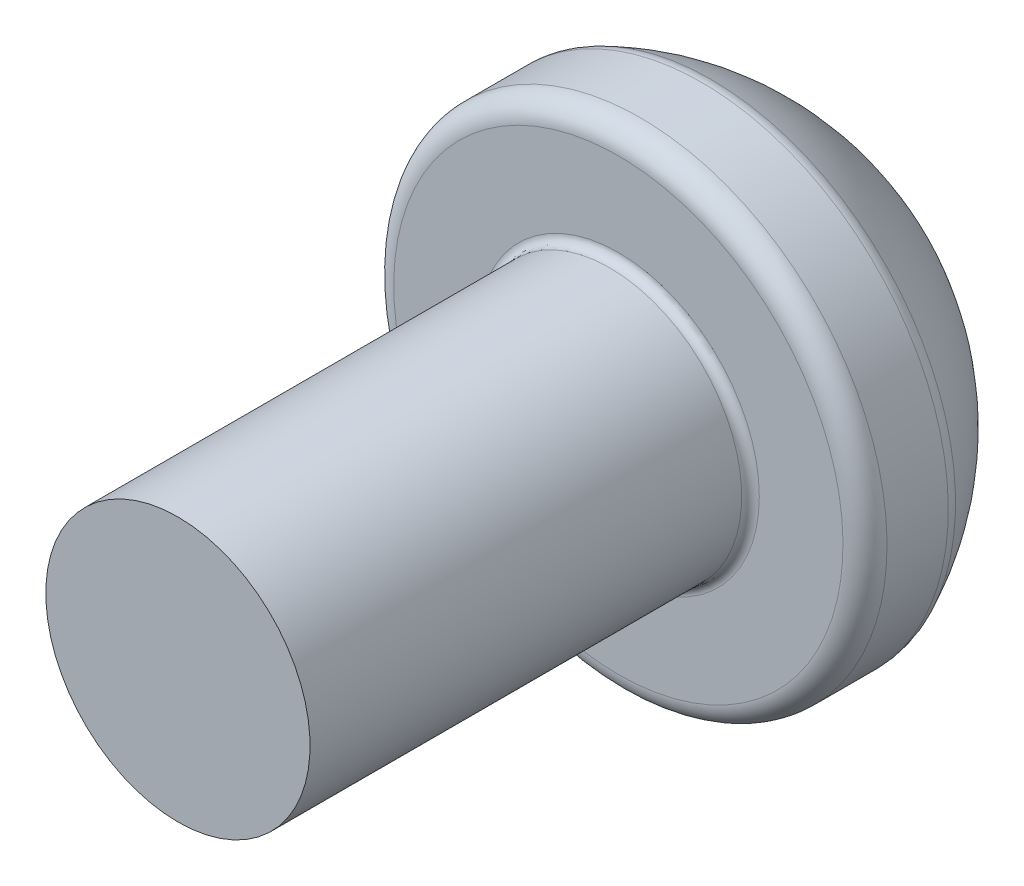
ISO-10303-21;
HEADER;
FILE_DESCRIPTION(('STEP AP214'),'2;1');
FILE_NAME('part.step','',(''),(''),'','','');
FILE_SCHEMA(('AUTOMOTIVE_DESIGN { 1 0 10303 214 1 1 1 1 }'));
ENDSEC;
DATA;
#1=APPLICATION_CONTEXT('core data for automotive mechanical design processes');
#2=APPLICATION_PROTOCOL_DEFINITION('international standard','automotive_design',2000,#1);
#3=PRODUCT_CONTEXT('',#1,'mechanical');
#4=PRODUCT('Part','Part','',(#3));
#5=PRODUCT_RELATED_PRODUCT_CATEGORY('part','',(#4));
#6=PRODUCT_DEFINITION_FORMATION('','',#4);
#7=PRODUCT_DEFINITION_CONTEXT('part definition',#1,'design');
#8=PRODUCT_DEFINITION('design','',#6,#7);
#9=PRODUCT_DEFINITION_SHAPE('','',#8);
#10=(LENGTH_UNIT() NAMED_UNIT(*) SI_UNIT(.MILLI.,.METRE.));
#11=(NAMED_UNIT(*) PLANE_ANGLE_UNIT() SI_UNIT($,.RADIAN.));
#12=(NAMED_UNIT(*) SI_UNIT($,.STERADIAN.) SOLID_ANGLE_UNIT());
#13=UNCERTAINTY_MEASURE_WITH_UNIT(LENGTH_MEASURE(1.E-05),#10,'distance_accuracy_value','');
#14=(GEOMETRIC_REPRESENTATION_CONTEXT(3) GLOBAL_UNCERTAINTY_ASSIGNED_CONTEXT((#13)) GLOBAL_UNIT_ASSIGNED_CONTEXT((#10,
#11,#12)) REPRESENTATION_CONTEXT('',''));
#15=CARTESIAN_POINT('',(0.,0.,0.));
#16=DIRECTION('',(0.,0.,1.));
#17=DIRECTION('',(1.,0.,0.));
#18=AXIS2_PLACEMENT_3D('',#15,#16,#17);
#19=CARTESIAN_POINT('',(0.,0.,5.00000000000001));
#20=DIRECTION('',(0.,0.,1.));
#21=DIRECTION('',(0.,-0.999999999999998,0.));
#22=AXIS2_PLACEMENT_3D('',#19,#20,#21);
#23=PLANE('',#22);
#24=CARTESIAN_POINT('',(0.,0.,5.00000000000001));
#25=DIRECTION('',(0.,0.,-1.));
#26=DIRECTION('',(0.,0.999999999999998,0.));
#27=AXIS2_PLACEMENT_3D('',#24,#25,#26);
#28=CIRCLE('',#27,1.5);
#29=CARTESIAN_POINT('',(0.,1.5,5.00000000000001));
#30=VERTEX_POINT('',#29);
#31=EDGE_CURVE('E266',#30,#30,#28,.T.);
#32=ORIENTED_EDGE('',*,*,#31,.F.);
#33=EDGE_LOOP('',(#32));
#34=FACE_BOUND('',#33,.T.);
#35=ADVANCED_FACE('F34',(#34),#23,.T.);
#36=CARTESIAN_POINT('',(0.,0.,-2.4));
#37=DIRECTION('',(0.,0.,-1.));
#38=DIRECTION('',(0.,0.999999999999998,0.));
#39=AXIS2_PLACEMENT_3D('',#36,#37,#38);
#40=CYLINDRICAL_SURFACE('',#39,1.5);
#41=CARTESIAN_POINT('',(0.,0.,0.100000000000003));
#42=DIRECTION('',(0.,0.,1.));
#43=DIRECTION('',(0.,-0.999999999999998,0.));
#44=AXIS2_PLACEMENT_3D('',#41,#42,#43);
#45=CIRCLE('',#44,1.5);
#46=CARTESIAN_POINT('',(0.,-1.5,0.100000000000003));
#47=VERTEX_POINT('',#46);
#48=EDGE_CURVE('E272',#47,#47,#45,.T.);
#49=ORIENTED_EDGE('',*,*,#48,.T.);
#50=EDGE_LOOP('',(#49));
#51=FACE_BOUND('',#50,.T.);
#52=ORIENTED_EDGE('',*,*,#31,.T.);
#53=EDGE_LOOP('',(#52));
#54=FACE_BOUND('',#53,.T.);
#55=ADVANCED_FACE('F307',(#51,#54),#40,.T.);
#56=CARTESIAN_POINT('',(0.,1.49999999999997,0.));
#57=DIRECTION('',(0.,0.,1.));
#58=DIRECTION('',(0.,-0.999999999999998,0.));
#59=AXIS2_PLACEMENT_3D('',#56,#57,#58);
#60=PLANE('',#59);
#61=CARTESIAN_POINT('',(0.,0.,0.));
#62=DIRECTION('',(0.,0.,1.));
#63=DIRECTION('',(0.,-0.999999999999998,0.));
#64=AXIS2_PLACEMENT_3D('',#61,#62,#63);
#65=CIRCLE('',#64,2.55);
#66=CARTESIAN_POINT('',(0.,-2.54999999999999,0.));
#67=VERTEX_POINT('',#66);
#68=EDGE_CURVE('E11',#67,#67,#65,.T.);
#69=ORIENTED_EDGE('',*,*,#68,.T.);
#70=EDGE_LOOP('',(#69));
#71=FACE_BOUND('',#70,.T.);
#72=CARTESIAN_POINT('',(0.,0.,0.));
#73=DIRECTION('',(0.,0.,1.));
#74=DIRECTION('',(0.,-0.999999999999998,0.));
#75=AXIS2_PLACEMENT_3D('',#72,#73,#74);
#76=CIRCLE('',#75,1.6);
#77=CARTESIAN_POINT('',(0.,-1.6,0.));
#78=VERTEX_POINT('',#77);
#79=EDGE_CURVE('E269',#78,#78,#76,.F.);
#80=ORIENTED_EDGE('',*,*,#79,.T.);
#81=EDGE_LOOP('',(#80));
#82=FACE_BOUND('',#81,.T.);
#83=ADVANCED_FACE('F312',(#71,#82),#60,.T.);
#84=CARTESIAN_POINT('',(0.,0.,-2.4));
#85=DIRECTION('',(0.,0.,-1.));
#86=DIRECTION('',(0.,0.999999999999998,0.));
#87=AXIS2_PLACEMENT_3D('',#84,#85,#86);
#88=CYLINDRICAL_SURFACE('',#87,2.8);
#89=CARTESIAN_POINT('',(0.,0.,-0.945424841825027));
#90=DIRECTION('',(0.,0.,1.));
#91=DIRECTION('',(0.,-0.999999999999998,0.));
#92=AXIS2_PLACEMENT_3D('',#89,#90,#91);
#93=CIRCLE('',#92,2.8);
#94=CARTESIAN_POINT('',(0.,-2.80000000000008,-0.945424841825026));
#95=VERTEX_POINT('',#94);
#96=EDGE_CURVE('E41',#95,#95,#93,.T.);
#97=ORIENTED_EDGE('',*,*,#96,.T.);
#98=EDGE_LOOP('',(#97));
#99=FACE_BOUND('',#98,.T.);
#100=CARTESIAN_POINT('',(0.,-1.66533453693773E-13,-0.249999999999986));
#101=DIRECTION('',(0.,0.,1.));
#102=DIRECTION('',(0.,-0.999999999999998,0.));
#103=AXIS2_PLACEMENT_3D('',#100,#101,#102);
#104=CIRCLE('',#103,2.8);
#105=CARTESIAN_POINT('',(0.,-2.80000000000016,-0.249999999999986));
#106=VERTEX_POINT('',#105);
#107=EDGE_CURVE('E278',#106,#106,#104,.F.);
#108=ORIENTED_EDGE('',*,*,#107,.T.);
#109=EDGE_LOOP('',(#108));
#110=FACE_BOUND('',#109,.T.);
#111=ADVANCED_FACE('F283',(#99,#110),#88,.T.);
#112=CARTESIAN_POINT('',(0.,0.,0.253000000000017));
#113=DIRECTION('',(0.,0.,-1.));
#114=DIRECTION('',(0.,0.999999999999998,0.));
#115=AXIS2_PLACEMENT_3D('',#112,#113,#114);
#116=SPHERICAL_SURFACE('',#115,3.06757379699332);
#117=CARTESIAN_POINT('',(0.,0.,-1.05175966463462));
#118=DIRECTION('',(0.,0.,1.));
#119=DIRECTION('',(0.,-0.999999999999998,0.));
#120=AXIS2_PLACEMENT_3D('',#117,#118,#119);
#121=CIRCLE('',#120,2.77625849256559);
#122=CARTESIAN_POINT('',(0.,2.77625849256557,-1.05175966463462));
#123=VERTEX_POINT('',#122);
#124=EDGE_CURVE('E275',#123,#123,#121,.F.);
#125=CARTESIAN_POINT('',(0.,0.,-2.4));
#126=DIRECTION('',(0.,0.,-1.));
#127=DIRECTION('',(0.,0.999999999999998,0.));
#128=AXIS2_PLACEMENT_3D('',#125,#126,#127);
#129=CIRCLE('',#128,1.54);
#130=CARTESIAN_POINT('',(0.,1.53999999999997,-2.4));
#131=VERTEX_POINT('',#130);
#132=EDGE_CURVE('E262',#131,#131,#129,.T.);
#133=CARTESIAN_POINT('',(0.,2.77625849256557,-1.05175966463462));
#134=CARTESIAN_POINT('',(0.,2.76802873560927,-1.06927093928297));
#135=CARTESIAN_POINT('',(0.,2.75963325856509,-1.08670432952201));
#136=CARTESIAN_POINT('',(0.,2.74251396302792,-1.1214091448773));
#137=CARTESIAN_POINT('',(0.,2.73379014453494,-1.13868056999355));
#138=CARTESIAN_POINT('',(0.,2.71601726482716,-1.17305525879907));
#139=CARTESIAN_POINT('',(0.,2.70696820361235,-1.19015852248834));
#140=CARTESIAN_POINT('',(0.,2.68854808514224,-1.22419076788491));
#141=CARTESIAN_POINT('',(0.,2.67917702788693,-1.24111974959221));
#142=CARTESIAN_POINT('',(0.,2.66011627086745,-1.27479736870806));
#143=CARTESIAN_POINT('',(0.,2.65042657110328,-1.2915460061166));
#144=CARTESIAN_POINT('',(0.,2.63073199894962,-1.32485694000621));
#145=CARTESIAN_POINT('',(0.,2.62072712656013,-1.34141923648728));
#146=CARTESIAN_POINT('',(0.,2.6004057912812,-1.37435155831383));
#147=CARTESIAN_POINT('',(0.,2.59008932839175,-1.3907215836593));
#148=CARTESIAN_POINT('',(0.,2.56914850596592,-1.42326350192949));
#149=CARTESIAN_POINT('',(0.,2.55852414642952,-1.43943539485421));
#150=CARTESIAN_POINT('',(0.,2.53697133476195,-1.47157525791774));
#151=CARTESIAN_POINT('',(0.,2.52604288263076,-1.48754322805655));
#152=CARTESIAN_POINT('',(0.,2.50388579871805,-1.51926952820363));
#153=CARTESIAN_POINT('',(0.,2.49265716693652,-1.53502785821189));
#154=CARTESIAN_POINT('',(0.,2.46990374414402,-1.56632923581349));
#155=CARTESIAN_POINT('',(0.,2.45837895313305,-1.58187228340683));
#156=CARTESIAN_POINT('',(0.,2.43503733834349,-1.6127375309767));
#157=CARTESIAN_POINT('',(0.,2.4232205145649,-1.62805973095323));
#158=CARTESIAN_POINT('',(0.,2.39929906526429,-1.65847779716217));
#159=CARTESIAN_POINT('',(0.,2.38719443974227,-1.67357366339458));
#160=CARTESIAN_POINT('',(0.,2.36270172102672,-1.70353365702699));
#161=CARTESIAN_POINT('',(0.,2.35031362783318,-1.718397784427));
#162=CARTESIAN_POINT('',(0.,2.32525840934235,-1.74788897828058));
#163=CARTESIAN_POINT('',(0.,2.31259128404505,-1.76251604473417));
#164=CARTESIAN_POINT('',(0.,2.28698253682215,-1.79152787946083));
#165=CARTESIAN_POINT('',(0.,2.27404091489653,-1.80591264773389));
#166=CARTESIAN_POINT('',(0.,2.24788780817621,-1.83443473562045));
#167=CARTESIAN_POINT('',(0.,2.23467632338149,-1.84857205523394));
#168=CARTESIAN_POINT('',(0.,2.2079882213068,-1.87659418392154));
#169=CARTESIAN_POINT('',(0.,2.19451160402683,-1.89047899299564));
#170=CARTESIAN_POINT('',(0.,2.1672980622964,-1.91799112913625));
#171=CARTESIAN_POINT('',(0.,2.15356113784594,-1.93161845620276));
#172=CARTESIAN_POINT('',(0.,2.12583190029252,-1.95861074905163));
#173=CARTESIAN_POINT('',(0.,2.11183958718956,-1.971975714834));
#174=CARTESIAN_POINT('',(0.,2.08360458229125,-1.99843849977674));
#175=CARTESIAN_POINT('',(0.,2.0693618904959,-2.0115363189371));
#176=CARTESIAN_POINT('',(0.,2.04063122782126,-2.03746012095012));
#177=CARTESIAN_POINT('',(0.,2.02614325694197,-2.05028610380276));
#178=CARTESIAN_POINT('',(0.,1.99692722353018,-2.07566164084562));
#179=CARTESIAN_POINT('',(0.,1.98219916099768,-2.08821119503583));
#180=CARTESIAN_POINT('',(0.,1.9525082176757,-2.11302938137545));
#181=CARTESIAN_POINT('',(0.,1.93754533688622,-2.12529801352486));
#182=CARTESIAN_POINT('',(0.,1.9073901145216,-2.14954996298589));
#183=CARTESIAN_POINT('',(0.,1.89219777294645,-2.16153328029752));
#184=CARTESIAN_POINT('',(0.,1.86158906864719,-2.18521030945437));
#185=CARTESIAN_POINT('',(0.,1.84617270592306,-2.19690402129959));
#186=CARTESIAN_POINT('',(0.,1.81512147914836,-2.21999765254702));
#187=CARTESIAN_POINT('',(0.,1.79948661509778,-2.23139757194922));
#188=CARTESIAN_POINT('',(0.,1.76800398382111,-2.25389953668146));
#189=CARTESIAN_POINT('',(0.,1.75215621659502,-2.2650015820115));
#190=CARTESIAN_POINT('',(0.,1.72025345299823,-2.28690382304649));
#191=CARTESIAN_POINT('',(0.,1.70419845662753,-2.29770401875144));
#192=CARTESIAN_POINT('',(0.,1.67188698427806,-2.31899869521752));
#193=CARTESIAN_POINT('',(0.,1.65563050829929,-2.32949317597865));
#194=CARTESIAN_POINT('',(0.,1.62292189353211,-2.35017265865099));
#195=CARTESIAN_POINT('',(0.,1.6064697547437,-2.36035766056221));
#196=CARTESIAN_POINT('',(0.,1.57337571941815,-2.38041456247663));
#197=CARTESIAN_POINT('',(0.,1.55673382288101,-2.39028646247984));
#198=CARTESIAN_POINT('',(0.,1.53999999999997,-2.4));
#199=B_SPLINE_CURVE_WITH_KNOTS('',3,(#133,#134,#135,#136,#137,#138,#139,#140,#141,#142,#143,
#144,#145,#146,#147,#148,#149,#150,#151,#152,#153,#154,#155,#156,#157,#158,#159,#160,#161,#162,
#163,#164,#165,#166,#167,#168,#169,#170,#171,#172,#173,#174,#175,#176,#177,#178,#179,#180,#181,
#182,#183,#184,#185,#186,#187,#188,#189,#190,#191,#192,#193,#194,#195,#196,#197,#198),
.UNSPECIFIED.,.F.,.F.,(4,2,2,2,2,2,2,2,2,2,2,2,2,2,2,2,2,2,2,2,2,2,2,2,2,2,2,2,2,2,2,2,4),(0.,
0.0580453449347523,0.116090689869505,0.174136034804257,0.232181379739009,0.290226724673761,
0.348272069608513,0.406317414543265,0.464362759478017,0.52240810441277,0.580453449347522,
0.638498794282274,0.696544139217026,0.754589484151778,0.81263482908653,0.870680174021282,
0.928725518956034,0.986770863890786,1.04481620882554,1.10286155376029,1.16090689869504,
1.2189522436298,1.27699758856455,1.3350429334993,1.39308827843405,1.4511336233688,
1.50917896830355,1.56722431323831,1.62526965817306,1.68331500310781,1.74136034804256,
1.79940569297732,1.85745103791207),.UNSPECIFIED.);
#200=EDGE_CURVE('BSEAM294',#123,#131,#199,.T.);
#201=ORIENTED_EDGE('',*,*,#124,.T.);
#202=ORIENTED_EDGE('',*,*,#132,.F.);
#203=ORIENTED_EDGE('',*,*,#200,.T.);
#204=ORIENTED_EDGE('',*,*,#200,.F.);
#205=EDGE_LOOP('',(#201,#203,#202,#204));
#206=FACE_BOUND('',#205,.T.);
#207=ADVANCED_FACE('F294',(#206),#116,.T.);
#208=CARTESIAN_POINT('',(0.,0.,-2.4));
#209=DIRECTION('',(0.,0.,-1.));
#210=DIRECTION('',(0.,0.999999999999998,0.));
#211=AXIS2_PLACEMENT_3D('',#208,#209,#210);
#212=PLANE('',#211);
#213=CARTESIAN_POINT('',(0.,0.,-2.4));
#214=DIRECTION('',(0.,0.,-1.));
#215=DIRECTION('',(0.,0.999999999999998,0.));
#216=AXIS2_PLACEMENT_3D('',#213,#214,#215);
#217=CIRCLE('',#216,1.4);
#218=CARTESIAN_POINT('',(0.217707917147349,-1.38296900283832,-2.39999999999999));
#219=VERTEX_POINT('',#218);
#220=CARTESIAN_POINT('',(-0.217707917147342,-1.38296900283835,-2.39999999999998));
#221=VERTEX_POINT('',#220);
#222=EDGE_CURVE('E185',#219,#221,#217,.T.);
#223=ORIENTED_EDGE('',*,*,#222,.F.);
#224=CARTESIAN_POINT('',(0.80750000000001,-1.39863102711205,-2.39999999999999));
#225=DIRECTION('',(0.,0.,1.));
#226=DIRECTION('',(0.,0.999999999999998,0.));
#227=AXIS2_PLACEMENT_3D('',#224,#225,#226);
#228=CIRCLE('',#227,0.59);
#229=CARTESIAN_POINT('',(1.08883233053061,-0.880025088273867,-2.39999999999998));
#230=VERTEX_POINT('',#229);
#231=EDGE_CURVE('E183',#230,#219,#228,.T.);
#232=ORIENTED_EDGE('',*,*,#231,.F.);
#233=CARTESIAN_POINT('',(0.,0.,-2.4));
#234=DIRECTION('',(0.,0.,-1.));
#235=DIRECTION('',(0.,0.999999999999998,0.));
#236=AXIS2_PLACEMENT_3D('',#233,#234,#235);
#237=CIRCLE('',#236,1.4);
#238=CARTESIAN_POINT('',(1.30654024767798,-0.502943914564638,-2.4));
#239=VERTEX_POINT('',#238);
#240=EDGE_CURVE('E180',#239,#230,#237,.T.);
#241=ORIENTED_EDGE('',*,*,#240,.F.);
#242=CARTESIAN_POINT('',(1.61499999999998,-1.2490009027033E-13,-2.39999999999999));
#243=DIRECTION('',(0.,0.,1.));
#244=DIRECTION('',(0.,0.999999999999998,0.));
#245=AXIS2_PLACEMENT_3D('',#242,#243,#244);
#246=CIRCLE('',#245,0.59);
#247=CARTESIAN_POINT('',(1.30654024767801,0.502943914564374,-2.40000000000002));
#248=VERTEX_POINT('',#247);
#249=EDGE_CURVE('E178',#248,#239,#246,.T.);
#250=ORIENTED_EDGE('',*,*,#249,.F.);
#251=CARTESIAN_POINT('',(0.,0.,-2.4));
#252=DIRECTION('',(0.,0.,-1.));
#253=DIRECTION('',(0.,0.999999999999998,0.));
#254=AXIS2_PLACEMENT_3D('',#251,#252,#253);
#255=CIRCLE('',#254,1.4);
#256=CARTESIAN_POINT('',(1.08883233053061,0.880025088273562,-2.40000000000001));
#257=VERTEX_POINT('',#256);
#258=EDGE_CURVE('E175',#257,#248,#255,.T.);
#259=ORIENTED_EDGE('',*,*,#258,.F.);
#260=CARTESIAN_POINT('',(0.807499999999899,1.3986310271118,-2.39999999999996));
#261=DIRECTION('',(0.,0.,1.));
#262=DIRECTION('',(0.,0.999999999999998,0.));
#263=AXIS2_PLACEMENT_3D('',#260,#261,#262);
#264=CIRCLE('',#263,0.59);
#265=CARTESIAN_POINT('',(0.2177079171473,1.38296900283813,-2.4));
#266=VERTEX_POINT('',#265);
#267=EDGE_CURVE('E170',#266,#257,#264,.T.);
#268=ORIENTED_EDGE('',*,*,#267,.F.);
#269=CARTESIAN_POINT('',(0.,0.,-2.4));
#270=DIRECTION('',(0.,0.,-1.));
#271=DIRECTION('',(0.,0.999999999999998,0.));
#272=AXIS2_PLACEMENT_3D('',#269,#270,#271);
#273=CIRCLE('',#272,1.4);
#274=CARTESIAN_POINT('',(-0.217707917147376,1.38296900283813,-2.39999999999999));
#275=VERTEX_POINT('',#274);
#276=EDGE_CURVE('E168',#275,#266,#273,.T.);
#277=ORIENTED_EDGE('',*,*,#276,.F.);
#278=CARTESIAN_POINT('',(-0.807499999999961,1.39863102711166,-2.39999999999998));
#279=DIRECTION('',(0.,0.,1.));
#280=DIRECTION('',(0.,0.999999999999998,0.));
#281=AXIS2_PLACEMENT_3D('',#278,#279,#280);
#282=CIRCLE('',#281,0.59);
#283=CARTESIAN_POINT('',(-1.08883233053072,0.88002508827352,-2.39999999999998));
#284=VERTEX_POINT('',#283);
#285=EDGE_CURVE('E149',#284,#275,#282,.T.);
#286=ORIENTED_EDGE('',*,*,#285,.F.);
#287=CARTESIAN_POINT('',(0.,0.,-2.4));
#288=DIRECTION('',(0.,0.,-1.));
#289=DIRECTION('',(0.,0.999999999999998,0.));
#290=AXIS2_PLACEMENT_3D('',#287,#288,#289);
#291=CIRCLE('',#290,1.4);
#292=CARTESIAN_POINT('',(-1.30654024767813,0.502943914564319,-2.39999999999998));
#293=VERTEX_POINT('',#292);
#294=EDGE_CURVE('E158',#293,#284,#291,.T.);
#295=ORIENTED_EDGE('',*,*,#294,.F.);
#296=CARTESIAN_POINT('',(-1.61500000000007,-1.94289029309402E-13,-2.39999999999999));
#297=DIRECTION('',(0.,0.,1.));
#298=DIRECTION('',(0.,0.999999999999998,0.));
#299=AXIS2_PLACEMENT_3D('',#296,#297,#298);
#300=CIRCLE('',#299,0.59);
#301=CARTESIAN_POINT('',(-1.30654024767802,-0.502943914564555,-2.39999999999996));
#302=VERTEX_POINT('',#301);
#303=EDGE_CURVE('E161',#302,#293,#300,.T.);
#304=ORIENTED_EDGE('',*,*,#303,.F.);
#305=CARTESIAN_POINT('',(0.,0.,-2.4));
#306=DIRECTION('',(0.,0.,-1.));
#307=DIRECTION('',(0.,0.999999999999998,0.));
#308=AXIS2_PLACEMENT_3D('',#305,#306,#307);
#309=CIRCLE('',#308,1.4);
#310=CARTESIAN_POINT('',(-1.0888323305307,-0.880025088273881,-2.39999999999996));
#311=VERTEX_POINT('',#310);
#312=EDGE_CURVE('E190',#311,#302,#309,.T.);
#313=ORIENTED_EDGE('',*,*,#312,.F.);
#314=CARTESIAN_POINT('',(-0.807500000000017,-1.39863102711194,-2.4));
#315=DIRECTION('',(0.,0.,1.));
#316=DIRECTION('',(0.,0.999999999999998,0.));
#317=AXIS2_PLACEMENT_3D('',#314,#315,#316);
#318=CIRCLE('',#317,0.59);
#319=EDGE_CURVE('E188',#221,#311,#318,.T.);
#320=ORIENTED_EDGE('',*,*,#319,.F.);
#321=EDGE_LOOP('',(#223,#232,#241,#250,#259,#268,#277,#286,#295,#304,#313,#320));
#322=FACE_BOUND('',#321,.T.);
#323=ORIENTED_EDGE('',*,*,#132,.T.);
#324=EDGE_LOOP('',(#323));
#325=FACE_BOUND('',#324,.T.);
#326=ADVANCED_FACE('F165',(#322,#325),#212,.T.);
#327=CARTESIAN_POINT('',(0.,0.,0.100000000000003));
#328=DIRECTION('',(0.,0.,1.));
#329=DIRECTION('',(0.,-0.999999999999998,0.));
#330=AXIS2_PLACEMENT_3D('',#327,#328,#329);
#331=TOROIDAL_SURFACE('',#330,1.6,0.1);
#332=ORIENTED_EDGE('',*,*,#48,.F.);
#333=EDGE_LOOP('',(#332));
#334=FACE_BOUND('',#333,.T.);
#335=ORIENTED_EDGE('',*,*,#79,.F.);
#336=EDGE_LOOP('',(#335));
#337=FACE_BOUND('',#336,.T.);
#338=ADVANCED_FACE('F290',(#334,#337),#331,.F.);
#339=CARTESIAN_POINT('',(0.,0.,-0.945424841825027));
#340=DIRECTION('',(0.,0.,1.));
#341=DIRECTION('',(0.,-0.999999999999998,0.));
#342=AXIS2_PLACEMENT_3D('',#339,#340,#341);
#343=TOROIDAL_SURFACE('',#342,2.55,0.25);
#344=ORIENTED_EDGE('',*,*,#96,.F.);
#345=EDGE_LOOP('',(#344));
#346=FACE_BOUND('',#345,.T.);
#347=ORIENTED_EDGE('',*,*,#124,.F.);
#348=EDGE_LOOP('',(#347));
#349=FACE_BOUND('',#348,.T.);
#350=ADVANCED_FACE('F286',(#346,#349),#343,.T.);
#351=CARTESIAN_POINT('',(0.,-1.66533453693773E-13,-0.249999999999986));
#352=DIRECTION('',(0.,0.,1.));
#353=DIRECTION('',(0.,-0.999999999999998,0.));
#354=AXIS2_PLACEMENT_3D('',#351,#352,#353);
#355=TOROIDAL_SURFACE('',#354,2.55,0.25);
#356=ORIENTED_EDGE('',*,*,#68,.F.);
#357=EDGE_LOOP('',(#356));
#358=FACE_BOUND('',#357,.T.);
#359=ORIENTED_EDGE('',*,*,#107,.F.);
#360=EDGE_LOOP('',(#359));
#361=FACE_BOUND('',#360,.T.);
#362=ADVANCED_FACE('F289',(#358,#361),#355,.T.);
#363=CARTESIAN_POINT('',(-1.615,-1.52655665885959E-13,-1.40000000000001));
#364=DIRECTION('',(0.,0.,-1.));
#365=DIRECTION('',(0.,0.999999999999998,0.));
#366=AXIS2_PLACEMENT_3D('',#363,#364,#365);
#367=CYLINDRICAL_SURFACE('',#366,0.59);
#368=CARTESIAN_POINT('',(-1.615,-1.52655665885959E-13,-1.40000000000001));
#369=DIRECTION('',(0.,0.,1.));
#370=DIRECTION('',(0.,0.999999999999998,0.));
#371=AXIS2_PLACEMENT_3D('',#368,#369,#370);
#372=CIRCLE('',#371,0.59);
#373=CARTESIAN_POINT('',(-1.30654024767805,-0.502943914564569,-1.39999999999998));
#374=VERTEX_POINT('',#373);
#375=CARTESIAN_POINT('',(-1.02499999999993,-1.11022302462516E-13,-1.39999999999999));
#376=VERTEX_POINT('',#375);
#377=EDGE_CURVE('E194',#374,#376,#372,.T.);
#378=ORIENTED_EDGE('',*,*,#377,.F.);
#379=DIRECTION('',(0.,0.,-1.));
#380=VECTOR('',#379,1.);
#381=CARTESIAN_POINT('',(-1.30654024767805,-0.502943914564569,-1.39999999999998));
#382=LINE('',#381,#380);
#383=EDGE_CURVE('E229',#374,#302,#382,.T.);
#384=ORIENTED_EDGE('',*,*,#383,.T.);
#385=ORIENTED_EDGE('',*,*,#303,.T.);
#386=DIRECTION('',(0.,0.,-1.));
#387=VECTOR('',#386,1.);
#388=CARTESIAN_POINT('',(-1.30654024767802,0.502943914564263,-1.39999999999998));
#389=LINE('',#388,#387);
#390=CARTESIAN_POINT('',(-1.30654024767802,0.502943914564263,-1.39999999999998));
#391=VERTEX_POINT('',#390);
#392=EDGE_CURVE('E48',#391,#293,#389,.T.);
#393=ORIENTED_EDGE('',*,*,#392,.F.);
#394=EDGE_CURVE('E193',#376,#391,#372,.T.);
#395=ORIENTED_EDGE('',*,*,#394,.F.);
#396=EDGE_LOOP('',(#378,#384,#385,#393,#395));
#397=FACE_BOUND('',#396,.T.);
#398=ADVANCED_FACE('F348',(#397),#367,.T.);
#399=CARTESIAN_POINT('',(-0.80749999999994,-1.39863102711192,-1.40000000000001));
#400=DIRECTION('',(0.,0.,-1.));
#401=DIRECTION('',(0.,0.999999999999998,0.));
#402=AXIS2_PLACEMENT_3D('',#399,#400,#401);
#403=CYLINDRICAL_SURFACE('',#402,0.59);
#404=CARTESIAN_POINT('',(-0.80749999999994,-1.39863102711192,-1.40000000000001));
#405=DIRECTION('',(0.,0.,1.));
#406=DIRECTION('',(0.,0.999999999999998,0.));
#407=AXIS2_PLACEMENT_3D('',#404,#405,#406);
#408=CIRCLE('',#407,0.59);
#409=CARTESIAN_POINT('',(-0.217707917147272,-1.38296900283838,-1.39999999999998));
#410=VERTEX_POINT('',#409);
#411=CARTESIAN_POINT('',(-0.512499999999853,-0.887676038879168,-1.39999999999998));
#412=VERTEX_POINT('',#411);
#413=EDGE_CURVE('E223',#410,#412,#408,.T.);
#414=ORIENTED_EDGE('',*,*,#413,.F.);
#415=DIRECTION('',(0.,0.,-1.));
#416=VECTOR('',#415,1.);
#417=CARTESIAN_POINT('',(-0.217707917147272,-1.38296900283838,-1.39999999999998));
#418=LINE('',#417,#416);
#419=EDGE_CURVE('E236',#410,#221,#418,.T.);
#420=ORIENTED_EDGE('',*,*,#419,.T.);
#421=ORIENTED_EDGE('',*,*,#319,.T.);
#422=DIRECTION('',(0.,0.,-1.));
#423=VECTOR('',#422,1.);
#424=CARTESIAN_POINT('',(-1.08883233053052,-0.880025088273811,-1.39999999999996));
#425=LINE('',#424,#423);
#426=CARTESIAN_POINT('',(-1.08883233053052,-0.880025088273811,-1.39999999999996));
#427=VERTEX_POINT('',#426);
#428=EDGE_CURVE('E233',#427,#311,#425,.T.);
#429=ORIENTED_EDGE('',*,*,#428,.F.);
#430=EDGE_CURVE('E222',#412,#427,#408,.T.);
#431=ORIENTED_EDGE('',*,*,#430,.F.);
#432=EDGE_LOOP('',(#414,#420,#421,#429,#431));
#433=FACE_BOUND('',#432,.T.);
#434=ADVANCED_FACE('F365',(#433),#403,.T.);
#435=CARTESIAN_POINT('',(0.80750000000001,-1.39863102711194,-1.39999999999999));
#436=DIRECTION('',(0.,0.,-1.));
#437=DIRECTION('',(0.,0.999999999999998,0.));
#438=AXIS2_PLACEMENT_3D('',#435,#436,#437);
#439=CYLINDRICAL_SURFACE('',#438,0.59);
#440=CARTESIAN_POINT('',(0.80750000000001,-1.39863102711194,-1.39999999999999));
#441=DIRECTION('',(0.,0.,1.));
#442=DIRECTION('',(0.,0.999999999999998,0.));
#443=AXIS2_PLACEMENT_3D('',#440,#441,#442);
#444=CIRCLE('',#443,0.59);
#445=CARTESIAN_POINT('',(1.08883233053075,-0.880025088273853,-1.39999999999998));
#446=VERTEX_POINT('',#445);
#447=CARTESIAN_POINT('',(0.512500000000082,-0.887676038879112,-1.39999999999998));
#448=VERTEX_POINT('',#447);
#449=EDGE_CURVE('E216',#446,#448,#444,.T.);
#450=ORIENTED_EDGE('',*,*,#449,.F.);
#451=DIRECTION('',(0.,0.,-1.));
#452=VECTOR('',#451,1.);
#453=CARTESIAN_POINT('',(1.08883233053075,-0.880025088273853,-1.39999999999998));
#454=LINE('',#453,#452);
#455=EDGE_CURVE('E242',#446,#230,#454,.T.);
#456=ORIENTED_EDGE('',*,*,#455,.T.);
#457=ORIENTED_EDGE('',*,*,#231,.T.);
#458=DIRECTION('',(0.,0.,-1.));
#459=VECTOR('',#458,1.);
#460=CARTESIAN_POINT('',(0.217707917147487,-1.38296900283835,-1.39999999999997));
#461=LINE('',#460,#459);
#462=CARTESIAN_POINT('',(0.217707917147487,-1.38296900283835,-1.39999999999997));
#463=VERTEX_POINT('',#462);
#464=EDGE_CURVE('E239',#463,#219,#461,.T.);
#465=ORIENTED_EDGE('',*,*,#464,.F.);
#466=EDGE_CURVE('E215',#448,#463,#444,.T.);
#467=ORIENTED_EDGE('',*,*,#466,.F.);
#468=EDGE_LOOP('',(#450,#456,#457,#465,#467));
#469=FACE_BOUND('',#468,.T.);
#470=ADVANCED_FACE('F373',(#469),#439,.T.);
#471=CARTESIAN_POINT('',(1.61500000000009,-1.38777878078145E-13,-1.39999999999999));
#472=DIRECTION('',(0.,0.,-1.));
#473=DIRECTION('',(0.,0.999999999999998,0.));
#474=AXIS2_PLACEMENT_3D('',#471,#472,#473);
#475=CYLINDRICAL_SURFACE('',#474,0.59);
#476=CARTESIAN_POINT('',(1.61500000000009,-1.38777878078145E-13,-1.39999999999999));
#477=DIRECTION('',(0.,0.,1.));
#478=DIRECTION('',(0.,0.999999999999998,0.));
#479=AXIS2_PLACEMENT_3D('',#476,#477,#478);
#480=CIRCLE('',#479,0.59);
#481=CARTESIAN_POINT('',(1.30654024767809,0.502943914564374,-1.40000000000001));
#482=VERTEX_POINT('',#481);
#483=CARTESIAN_POINT('',(1.02500000000008,0.,-1.40000000000001));
#484=VERTEX_POINT('',#483);
#485=EDGE_CURVE('E209',#482,#484,#480,.T.);
#486=ORIENTED_EDGE('',*,*,#485,.F.);
#487=DIRECTION('',(0.,0.,-1.));
#488=VECTOR('',#487,1.);
#489=CARTESIAN_POINT('',(1.30654024767809,0.502943914564374,-1.40000000000001));
#490=LINE('',#489,#488);
#491=EDGE_CURVE('E248',#482,#248,#490,.T.);
#492=ORIENTED_EDGE('',*,*,#491,.T.);
#493=ORIENTED_EDGE('',*,*,#249,.T.);
#494=DIRECTION('',(0.,0.,-1.));
#495=VECTOR('',#494,1.);
#496=CARTESIAN_POINT('',(1.30654024767812,-0.502943914564569,-1.40000000000002));
#497=LINE('',#496,#495);
#498=CARTESIAN_POINT('',(1.30654024767812,-0.502943914564569,-1.40000000000002));
#499=VERTEX_POINT('',#498);
#500=EDGE_CURVE('E245',#499,#239,#497,.T.);
#501=ORIENTED_EDGE('',*,*,#500,.F.);
#502=EDGE_CURVE('E208',#484,#499,#480,.T.);
#503=ORIENTED_EDGE('',*,*,#502,.F.);
#504=EDGE_LOOP('',(#486,#492,#493,#501,#503));
#505=FACE_BOUND('',#504,.T.);
#506=ADVANCED_FACE('F381',(#505),#475,.T.);
#507=CARTESIAN_POINT('',(0.807500000000093,1.39863102711178,-1.39999999999996));
#508=DIRECTION('',(0.,0.,-1.));
#509=DIRECTION('',(0.,0.999999999999998,0.));
#510=AXIS2_PLACEMENT_3D('',#507,#508,#509);
#511=CYLINDRICAL_SURFACE('',#510,0.59);
#512=CARTESIAN_POINT('',(0.807500000000093,1.39863102711178,-1.39999999999996));
#513=DIRECTION('',(0.,0.,1.));
#514=DIRECTION('',(0.,0.999999999999998,0.));
#515=AXIS2_PLACEMENT_3D('',#512,#513,#514);
#516=CIRCLE('',#515,0.59);
#517=CARTESIAN_POINT('',(0.21770791714739,1.38296900283807,-1.39999999999998));
#518=VERTEX_POINT('',#517);
#519=CARTESIAN_POINT('',(0.512500000000068,0.887676038878973,-1.39999999999998));
#520=VERTEX_POINT('',#519);
#521=EDGE_CURVE('E56',#518,#520,#516,.T.);
#522=ORIENTED_EDGE('',*,*,#521,.F.);
#523=DIRECTION('',(0.,0.,-1.));
#524=VECTOR('',#523,1.);
#525=CARTESIAN_POINT('',(0.21770791714739,1.38296900283807,-1.39999999999998));
#526=LINE('',#525,#524);
#527=EDGE_CURVE('E254',#518,#266,#526,.T.);
#528=ORIENTED_EDGE('',*,*,#527,.T.);
#529=ORIENTED_EDGE('',*,*,#267,.T.);
#530=DIRECTION('',(0.,0.,-1.));
#531=VECTOR('',#530,1.);
#532=CARTESIAN_POINT('',(1.08883233053065,0.880025088273645,-1.40000000000001));
#533=LINE('',#532,#531);
#534=CARTESIAN_POINT('',(1.08883233053065,0.880025088273645,-1.40000000000001));
#535=VERTEX_POINT('',#534);
#536=EDGE_CURVE('E251',#535,#257,#533,.T.);
#537=ORIENTED_EDGE('',*,*,#536,.F.);
#538=EDGE_CURVE('E203',#520,#535,#516,.T.);
#539=ORIENTED_EDGE('',*,*,#538,.F.);
#540=EDGE_LOOP('',(#522,#528,#529,#537,#539));
#541=FACE_BOUND('',#540,.T.);
#542=ADVANCED_FACE('F389',(#541),#511,.T.);
#543=CARTESIAN_POINT('',(-0.807499999999912,1.39863102711167,-1.39999999999998));
#544=DIRECTION('',(0.,0.,-1.));
#545=DIRECTION('',(0.,0.999999999999998,0.));
#546=AXIS2_PLACEMENT_3D('',#543,#544,#545);
#547=CYLINDRICAL_SURFACE('',#546,0.59);
#548=CARTESIAN_POINT('',(-0.807499999999912,1.39863102711167,-1.39999999999998));
#549=DIRECTION('',(0.,0.,1.));
#550=DIRECTION('',(0.,0.999999999999998,0.));
#551=AXIS2_PLACEMENT_3D('',#548,#549,#550);
#552=CIRCLE('',#551,0.59);
#553=CARTESIAN_POINT('',(-1.08883233053053,0.88002508827352,-1.39999999999998));
#554=VERTEX_POINT('',#553);
#555=CARTESIAN_POINT('',(-0.512500000000027,0.88767603887896,-1.4));
#556=VERTEX_POINT('',#555);
#557=EDGE_CURVE('E153',#554,#556,#552,.T.);
#558=ORIENTED_EDGE('',*,*,#557,.F.);
#559=DIRECTION('',(0.,0.,-1.));
#560=VECTOR('',#559,1.);
#561=CARTESIAN_POINT('',(-1.08883233053053,0.88002508827352,-1.39999999999998));
#562=LINE('',#561,#560);
#563=EDGE_CURVE('E145',#554,#284,#562,.T.);
#564=ORIENTED_EDGE('',*,*,#563,.T.);
#565=ORIENTED_EDGE('',*,*,#285,.T.);
#566=DIRECTION('',(0.,0.,-1.));
#567=VECTOR('',#566,1.);
#568=CARTESIAN_POINT('',(-0.21770791714739,1.38296900283816,-1.39999999999999));
#569=LINE('',#568,#567);
#570=CARTESIAN_POINT('',(-0.21770791714739,1.38296900283816,-1.39999999999999));
#571=VERTEX_POINT('',#570);
#572=EDGE_CURVE('E155',#571,#275,#569,.T.);
#573=ORIENTED_EDGE('',*,*,#572,.F.);
#574=EDGE_CURVE('E199',#556,#571,#552,.T.);
#575=ORIENTED_EDGE('',*,*,#574,.F.);
#576=EDGE_LOOP('',(#558,#564,#565,#573,#575));
#577=FACE_BOUND('',#576,.T.);
#578=ADVANCED_FACE('F146',(#577),#547,.T.);
#579=CARTESIAN_POINT('',(-0.807499999999906,-1.80411241501588E-13,-1.40000000000001));
#580=DIRECTION('',(0.,0.,-1.));
#581=DIRECTION('',(0.,0.999999999999998,0.));
#582=AXIS2_PLACEMENT_3D('',#579,#580,#581);
#583=PLANE('',#582);
#584=CARTESIAN_POINT('',(0.,0.,-1.4));
#585=DIRECTION('',(0.,0.,-1.));
#586=DIRECTION('',(0.,0.999999999999998,0.));
#587=AXIS2_PLACEMENT_3D('',#584,#585,#586);
#588=CIRCLE('',#587,1.025);
#589=EDGE_CURVE('E494',#376,#556,#588,.T.);
#590=ORIENTED_EDGE('',*,*,#589,.F.);
#591=ORIENTED_EDGE('',*,*,#394,.T.);
#592=CARTESIAN_POINT('',(0.,0.,-1.4));
#593=DIRECTION('',(0.,0.,-1.));
#594=DIRECTION('',(0.,0.999999999999998,0.));
#595=AXIS2_PLACEMENT_3D('',#592,#593,#594);
#596=CIRCLE('',#595,1.4);
#597=EDGE_CURVE('E197',#391,#554,#596,.T.);
#598=ORIENTED_EDGE('',*,*,#597,.T.);
#599=ORIENTED_EDGE('',*,*,#557,.T.);
#600=EDGE_LOOP('',(#590,#591,#598,#599));
#601=FACE_BOUND('',#600,.T.);
#602=ADVANCED_FACE('F404',(#601),#583,.T.);
#603=EDGE_CURVE('E500',#412,#376,#588,.T.);
#604=ORIENTED_EDGE('',*,*,#603,.F.);
#605=ORIENTED_EDGE('',*,*,#430,.T.);
#606=CARTESIAN_POINT('',(0.,0.,-1.4));
#607=DIRECTION('',(0.,0.,-1.));
#608=DIRECTION('',(0.,0.999999999999998,0.));
#609=AXIS2_PLACEMENT_3D('',#606,#607,#608);
#610=CIRCLE('',#609,1.4);
#611=EDGE_CURVE('E226',#427,#374,#610,.T.);
#612=ORIENTED_EDGE('',*,*,#611,.T.);
#613=ORIENTED_EDGE('',*,*,#377,.T.);
#614=EDGE_LOOP('',(#604,#605,#612,#613));
#615=FACE_BOUND('',#614,.T.);
#616=ADVANCED_FACE('F411',(#615),#583,.T.);
#617=EDGE_CURVE('E501',#448,#412,#588,.T.);
#618=ORIENTED_EDGE('',*,*,#617,.F.);
#619=ORIENTED_EDGE('',*,*,#466,.T.);
#620=CARTESIAN_POINT('',(0.,0.,-1.4));
#621=DIRECTION('',(0.,0.,-1.));
#622=DIRECTION('',(0.,0.999999999999998,0.));
#623=AXIS2_PLACEMENT_3D('',#620,#621,#622);
#624=CIRCLE('',#623,1.4);
#625=EDGE_CURVE('E219',#463,#410,#624,.T.);
#626=ORIENTED_EDGE('',*,*,#625,.T.);
#627=ORIENTED_EDGE('',*,*,#413,.T.);
#628=EDGE_LOOP('',(#618,#619,#626,#627));
#629=FACE_BOUND('',#628,.T.);
#630=ADVANCED_FACE('F420',(#629),#583,.T.);
#631=EDGE_CURVE('E263',#484,#448,#588,.T.);
#632=ORIENTED_EDGE('',*,*,#631,.F.);
#633=ORIENTED_EDGE('',*,*,#502,.T.);
#634=CARTESIAN_POINT('',(0.,0.,-1.4));
#635=DIRECTION('',(0.,0.,-1.));
#636=DIRECTION('',(0.,0.999999999999998,0.));
#637=AXIS2_PLACEMENT_3D('',#634,#635,#636);
#638=CIRCLE('',#637,1.4);
#639=EDGE_CURVE('E212',#499,#446,#638,.T.);
#640=ORIENTED_EDGE('',*,*,#639,.T.);
#641=ORIENTED_EDGE('',*,*,#449,.T.);
#642=EDGE_LOOP('',(#632,#633,#640,#641));
#643=FACE_BOUND('',#642,.T.);
#644=ADVANCED_FACE('F427',(#643),#583,.T.);
#645=EDGE_CURVE('E259',#520,#484,#588,.T.);
#646=ORIENTED_EDGE('',*,*,#645,.F.);
#647=ORIENTED_EDGE('',*,*,#538,.T.);
#648=CARTESIAN_POINT('',(0.,0.,-1.4));
#649=DIRECTION('',(0.,0.,-1.));
#650=DIRECTION('',(0.,0.999999999999998,0.));
#651=AXIS2_PLACEMENT_3D('',#648,#649,#650);
#652=CIRCLE('',#651,1.4);
#653=EDGE_CURVE('E205',#535,#482,#652,.T.);
#654=ORIENTED_EDGE('',*,*,#653,.T.);
#655=ORIENTED_EDGE('',*,*,#485,.T.);
#656=EDGE_LOOP('',(#646,#647,#654,#655));
#657=FACE_BOUND('',#656,.T.);
#658=ADVANCED_FACE('F434',(#657),#583,.T.);
#659=EDGE_CURVE('E232',#556,#520,#588,.T.);
#660=ORIENTED_EDGE('',*,*,#659,.F.);
#661=ORIENTED_EDGE('',*,*,#574,.T.);
#662=CARTESIAN_POINT('',(0.,0.,-1.4));
#663=DIRECTION('',(0.,0.,-1.));
#664=DIRECTION('',(0.,0.999999999999998,0.));
#665=AXIS2_PLACEMENT_3D('',#662,#663,#664);
#666=CIRCLE('',#665,1.4);
#667=EDGE_CURVE('E201',#571,#518,#666,.T.);
#668=ORIENTED_EDGE('',*,*,#667,.T.);
#669=ORIENTED_EDGE('',*,*,#521,.T.);
#670=EDGE_LOOP('',(#660,#661,#668,#669));
#671=FACE_BOUND('',#670,.T.);
#672=ADVANCED_FACE('F414',(#671),#583,.T.);
#673=CARTESIAN_POINT('',(0.,0.,-1.4));
#674=DIRECTION('',(0.,0.,-1.));
#675=DIRECTION('',(0.,0.999999999999998,0.));
#676=AXIS2_PLACEMENT_3D('',#673,#674,#675);
#677=CYLINDRICAL_SURFACE('',#676,1.4);
#678=ORIENTED_EDGE('',*,*,#312,.T.);
#679=ORIENTED_EDGE('',*,*,#383,.F.);
#680=ORIENTED_EDGE('',*,*,#611,.F.);
#681=ORIENTED_EDGE('',*,*,#428,.T.);
#682=EDGE_LOOP('',(#678,#679,#680,#681));
#683=FACE_BOUND('',#682,.T.);
#684=ADVANCED_FACE('F447',(#683),#677,.F.);
#685=CARTESIAN_POINT('',(0.,0.,-1.4));
#686=DIRECTION('',(0.,0.,-1.));
#687=DIRECTION('',(0.,0.999999999999998,0.));
#688=AXIS2_PLACEMENT_3D('',#685,#686,#687);
#689=CYLINDRICAL_SURFACE('',#688,1.4);
#690=ORIENTED_EDGE('',*,*,#222,.T.);
#691=ORIENTED_EDGE('',*,*,#419,.F.);
#692=ORIENTED_EDGE('',*,*,#625,.F.);
#693=ORIENTED_EDGE('',*,*,#464,.T.);
#694=EDGE_LOOP('',(#690,#691,#692,#693));
#695=FACE_BOUND('',#694,.T.);
#696=ADVANCED_FACE('F453',(#695),#689,.F.);
#697=CARTESIAN_POINT('',(0.,0.,-1.4));
#698=DIRECTION('',(0.,0.,-1.));
#699=DIRECTION('',(0.,0.999999999999998,0.));
#700=AXIS2_PLACEMENT_3D('',#697,#698,#699);
#701=CYLINDRICAL_SURFACE('',#700,1.4);
#702=ORIENTED_EDGE('',*,*,#240,.T.);
#703=ORIENTED_EDGE('',*,*,#455,.F.);
#704=ORIENTED_EDGE('',*,*,#639,.F.);
#705=ORIENTED_EDGE('',*,*,#500,.T.);
#706=EDGE_LOOP('',(#702,#703,#704,#705));
#707=FACE_BOUND('',#706,.T.);
#708=ADVANCED_FACE('F461',(#707),#701,.F.);
#709=CARTESIAN_POINT('',(0.,0.,-1.4));
#710=DIRECTION('',(0.,0.,-1.));
#711=DIRECTION('',(0.,0.999999999999998,0.));
#712=AXIS2_PLACEMENT_3D('',#709,#710,#711);
#713=CYLINDRICAL_SURFACE('',#712,1.4);
#714=ORIENTED_EDGE('',*,*,#258,.T.);
#715=ORIENTED_EDGE('',*,*,#491,.F.);
#716=ORIENTED_EDGE('',*,*,#653,.F.);
#717=ORIENTED_EDGE('',*,*,#536,.T.);
#718=EDGE_LOOP('',(#714,#715,#716,#717));
#719=FACE_BOUND('',#718,.T.);
#720=ADVANCED_FACE('F469',(#719),#713,.F.);
#721=CARTESIAN_POINT('',(0.,0.,-1.4));
#722=DIRECTION('',(0.,0.,-1.));
#723=DIRECTION('',(0.,0.999999999999998,0.));
#724=AXIS2_PLACEMENT_3D('',#721,#722,#723);
#725=CYLINDRICAL_SURFACE('',#724,1.4);
#726=ORIENTED_EDGE('',*,*,#276,.T.);
#727=ORIENTED_EDGE('',*,*,#527,.F.);
#728=ORIENTED_EDGE('',*,*,#667,.F.);
#729=ORIENTED_EDGE('',*,*,#572,.T.);
#730=EDGE_LOOP('',(#726,#727,#728,#729));
#731=FACE_BOUND('',#730,.T.);
#732=ADVANCED_FACE('F477',(#731),#725,.F.);
#733=CARTESIAN_POINT('',(0.,0.,-1.4));
#734=DIRECTION('',(0.,0.,-1.));
#735=DIRECTION('',(0.,0.999999999999998,0.));
#736=AXIS2_PLACEMENT_3D('',#733,#734,#735);
#737=CYLINDRICAL_SURFACE('',#736,1.4);
#738=ORIENTED_EDGE('',*,*,#294,.T.);
#739=ORIENTED_EDGE('',*,*,#563,.F.);
#740=ORIENTED_EDGE('',*,*,#597,.F.);
#741=ORIENTED_EDGE('',*,*,#392,.T.);
#742=EDGE_LOOP('',(#738,#739,#740,#741));
#743=FACE_BOUND('',#742,.T.);
#744=ADVANCED_FACE('F159',(#743),#737,.F.);
#745=CARTESIAN_POINT('',(0.,0.,-1.4));
#746=DIRECTION('',(0.,0.,-1.));
#747=DIRECTION('',(0.,0.999999999999998,0.));
#748=AXIS2_PLACEMENT_3D('',#745,#746,#747);
#749=CONICAL_SURFACE('',#748,1.025,1.22173047639603);
#750=CARTESIAN_POINT('',(0.,0.,-1.02693050987714));
#751=VERTEX_POINT('',#750);
#752=VERTEX_LOOP('',#751);
#753=FACE_BOUND('',#752,.T.);
#754=ORIENTED_EDGE('',*,*,#645,.T.);
#755=ORIENTED_EDGE('',*,*,#631,.T.);
#756=ORIENTED_EDGE('',*,*,#617,.T.);
#757=ORIENTED_EDGE('',*,*,#603,.T.);
#758=ORIENTED_EDGE('',*,*,#589,.T.);
#759=ORIENTED_EDGE('',*,*,#659,.T.);
#760=EDGE_LOOP('',(#754,#755,#756,#757,#758,#759));
#761=FACE_BOUND('',#760,.T.);
#762=ADVANCED_FACE('F353',(#753,#761),#749,.F.);
#763=CLOSED_SHELL('',(#35,#55,#83,#111,#207,#326,#338,#350,#362,#398,#434,#470,#506,#542,#578,
#602,#616,#630,#644,#658,#672,#684,#696,#708,#720,#732,#744,#762));
#764=MANIFOLD_SOLID_BREP('B2',#763);
#765=ADVANCED_BREP_SHAPE_REPRESENTATION('',(#18,#764),#14);
#766=SHAPE_DEFINITION_REPRESENTATION(#9,#765);
ENDSEC;
END-ISO-10303-21;
